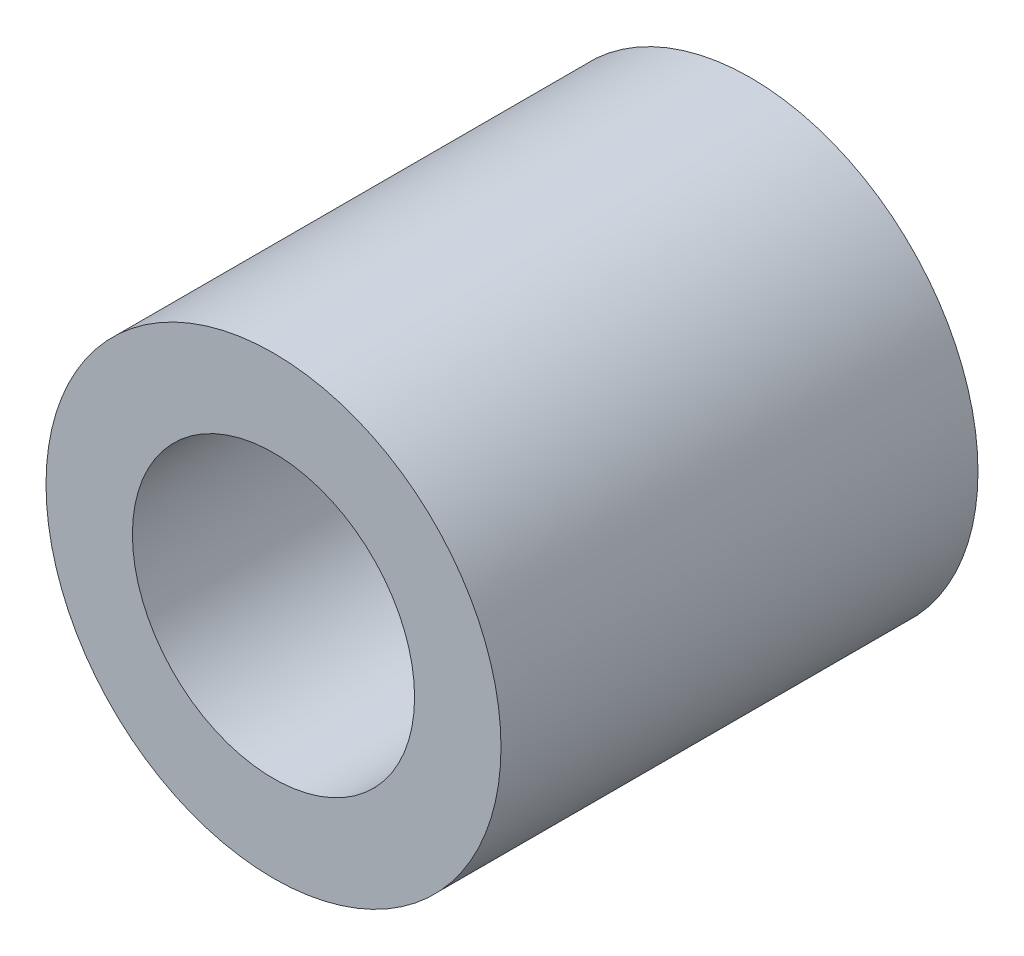
ISO-10303-21;
HEADER;
FILE_DESCRIPTION(('STEP AP214'),'2;1');
FILE_NAME('part.step','',(''),(''),'','','');
FILE_SCHEMA(('AUTOMOTIVE_DESIGN { 1 0 10303 214 1 1 1 1 }'));
ENDSEC;
DATA;
#1=APPLICATION_CONTEXT('core data for automotive mechanical design processes');
#2=APPLICATION_PROTOCOL_DEFINITION('international standard','automotive_design',2000,#1);
#3=PRODUCT_CONTEXT('',#1,'mechanical');
#4=PRODUCT('Part','Part','',(#3));
#5=PRODUCT_RELATED_PRODUCT_CATEGORY('part','',(#4));
#6=PRODUCT_DEFINITION_FORMATION('','',#4);
#7=PRODUCT_DEFINITION_CONTEXT('part definition',#1,'design');
#8=PRODUCT_DEFINITION('design','',#6,#7);
#9=PRODUCT_DEFINITION_SHAPE('','',#8);
#10=(LENGTH_UNIT() NAMED_UNIT(*) SI_UNIT(.MILLI.,.METRE.));
#11=(NAMED_UNIT(*) PLANE_ANGLE_UNIT() SI_UNIT($,.RADIAN.));
#12=(NAMED_UNIT(*) SI_UNIT($,.STERADIAN.) SOLID_ANGLE_UNIT());
#13=UNCERTAINTY_MEASURE_WITH_UNIT(LENGTH_MEASURE(1.E-05),#10,'distance_accuracy_value','');
#14=(GEOMETRIC_REPRESENTATION_CONTEXT(3) GLOBAL_UNCERTAINTY_ASSIGNED_CONTEXT((#13)) GLOBAL_UNIT_ASSIGNED_CONTEXT((#10,
#11,#12)) REPRESENTATION_CONTEXT('',''));
#15=CARTESIAN_POINT('',(0.,0.,0.));
#16=DIRECTION('',(0.,0.,1.));
#17=DIRECTION('',(1.,0.,0.));
#18=AXIS2_PLACEMENT_3D('',#15,#16,#17);
#19=CARTESIAN_POINT('',(0.,0.,100.));
#20=DIRECTION('',(0.,0.,1.));
#21=DIRECTION('',(1.,0.,0.));
#22=AXIS2_PLACEMENT_3D('',#19,#20,#21);
#23=PLANE('',#22);
#24=CARTESIAN_POINT('',(0.,0.,100.));
#25=DIRECTION('',(0.,0.,1.));
#26=DIRECTION('',(1.,0.,0.));
#27=AXIS2_PLACEMENT_3D('',#24,#25,#26);
#28=CIRCLE('',#27,47.6916631277271);
#29=CARTESIAN_POINT('',(47.6916631277271,0.,100.));
#30=VERTEX_POINT('',#29);
#31=EDGE_CURVE('E11',#30,#30,#28,.T.);
#32=ORIENTED_EDGE('',*,*,#31,.T.);
#33=EDGE_LOOP('',(#32));
#34=FACE_BOUND('',#33,.T.);
#35=CARTESIAN_POINT('',(0.,0.,100.));
#36=DIRECTION('',(0.,0.,1.));
#37=DIRECTION('',(1.,0.,0.));
#38=AXIS2_PLACEMENT_3D('',#35,#36,#37);
#39=CIRCLE('',#38,29.5783703112479);
#40=CARTESIAN_POINT('',(29.5783703112479,0.,100.));
#41=VERTEX_POINT('',#40);
#42=EDGE_CURVE('E56',#41,#41,#39,.T.);
#43=ORIENTED_EDGE('',*,*,#42,.F.);
#44=EDGE_LOOP('',(#43));
#45=FACE_BOUND('',#44,.T.);
#46=ADVANCED_FACE('F43',(#34,#45),#23,.T.);
#47=CARTESIAN_POINT('',(0.,0.,0.));
#48=DIRECTION('',(0.,0.,1.));
#49=DIRECTION('',(1.,0.,0.));
#50=AXIS2_PLACEMENT_3D('',#47,#48,#49);
#51=PLANE('',#50);
#52=CARTESIAN_POINT('',(0.,0.,0.));
#53=DIRECTION('',(0.,0.,1.));
#54=DIRECTION('',(1.,0.,0.));
#55=AXIS2_PLACEMENT_3D('',#52,#53,#54);
#56=CIRCLE('',#55,47.6916631277271);
#57=CARTESIAN_POINT('',(47.6916631277271,0.,0.));
#58=VERTEX_POINT('',#57);
#59=EDGE_CURVE('E47',#58,#58,#56,.T.);
#60=ORIENTED_EDGE('',*,*,#59,.F.);
#61=EDGE_LOOP('',(#60));
#62=FACE_BOUND('',#61,.T.);
#63=CARTESIAN_POINT('',(0.,0.,0.));
#64=DIRECTION('',(0.,0.,1.));
#65=DIRECTION('',(1.,0.,0.));
#66=AXIS2_PLACEMENT_3D('',#63,#64,#65);
#67=CIRCLE('',#66,29.5783703112479);
#68=CARTESIAN_POINT('',(29.5783703112479,0.,0.));
#69=VERTEX_POINT('',#68);
#70=EDGE_CURVE('E58',#69,#69,#67,.T.);
#71=ORIENTED_EDGE('',*,*,#70,.T.);
#72=EDGE_LOOP('',(#71));
#73=FACE_BOUND('',#72,.T.);
#74=ADVANCED_FACE('F70',(#62,#73),#51,.F.);
#75=CARTESIAN_POINT('',(0.,0.,100.));
#76=DIRECTION('',(0.,0.,-1.));
#77=DIRECTION('',(-1.,0.,0.));
#78=AXIS2_PLACEMENT_3D('',#75,#76,#77);
#79=CYLINDRICAL_SURFACE('',#78,47.6916631277271);
#80=ORIENTED_EDGE('',*,*,#31,.F.);
#81=EDGE_LOOP('',(#80));
#82=FACE_BOUND('',#81,.T.);
#83=ORIENTED_EDGE('',*,*,#59,.T.);
#84=EDGE_LOOP('',(#83));
#85=FACE_BOUND('',#84,.T.);
#86=ADVANCED_FACE('F45',(#82,#85),#79,.T.);
#87=CARTESIAN_POINT('',(0.,0.,100.));
#88=DIRECTION('',(0.,0.,-1.));
#89=DIRECTION('',(-1.,0.,0.));
#90=AXIS2_PLACEMENT_3D('',#87,#88,#89);
#91=CYLINDRICAL_SURFACE('',#90,29.5783703112479);
#92=ORIENTED_EDGE('',*,*,#42,.T.);
#93=EDGE_LOOP('',(#92));
#94=FACE_BOUND('',#93,.T.);
#95=ORIENTED_EDGE('',*,*,#70,.F.);
#96=EDGE_LOOP('',(#95));
#97=FACE_BOUND('',#96,.T.);
#98=ADVANCED_FACE('F66',(#94,#97),#91,.F.);
#99=CLOSED_SHELL('',(#46,#74,#86,#98));
#100=MANIFOLD_SOLID_BREP('B2',#99);
#101=ADVANCED_BREP_SHAPE_REPRESENTATION('',(#18,#100),#14);
#102=SHAPE_DEFINITION_REPRESENTATION(#9,#101);
ENDSEC;
END-ISO-10303-21;
